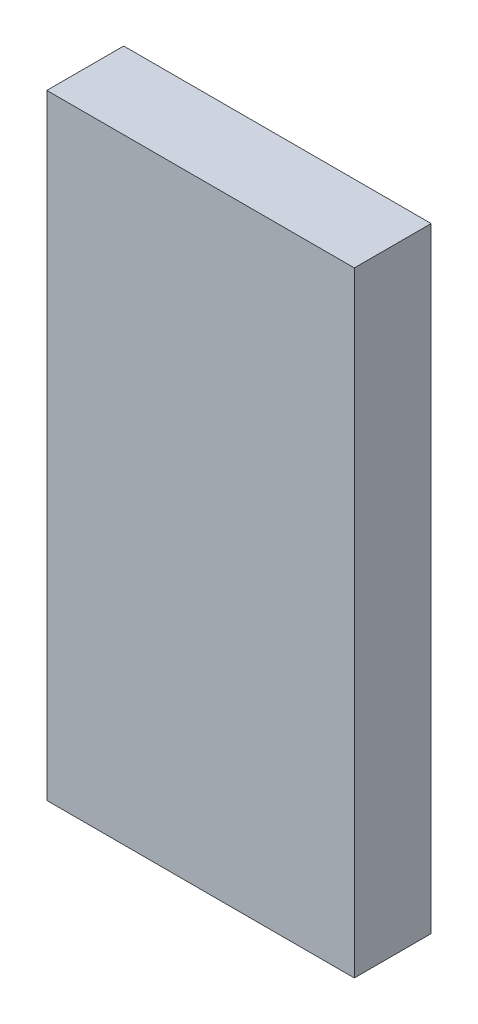
ISO-10303-21;
HEADER;
FILE_DESCRIPTION(('STEP AP214'),'2;1');
FILE_NAME('part.step','',(''),(''),'','','');
FILE_SCHEMA(('AUTOMOTIVE_DESIGN { 1 0 10303 214 1 1 1 1 }'));
ENDSEC;
DATA;
#1=APPLICATION_CONTEXT('core data for automotive mechanical design processes');
#2=APPLICATION_PROTOCOL_DEFINITION('international standard','automotive_design',2000,#1);
#3=PRODUCT_CONTEXT('',#1,'mechanical');
#4=PRODUCT('Part','Part','',(#3));
#5=PRODUCT_RELATED_PRODUCT_CATEGORY('part','',(#4));
#6=PRODUCT_DEFINITION_FORMATION('','',#4);
#7=PRODUCT_DEFINITION_CONTEXT('part definition',#1,'design');
#8=PRODUCT_DEFINITION('design','',#6,#7);
#9=PRODUCT_DEFINITION_SHAPE('','',#8);
#10=(LENGTH_UNIT() NAMED_UNIT(*) SI_UNIT(.MILLI.,.METRE.));
#11=(NAMED_UNIT(*) PLANE_ANGLE_UNIT() SI_UNIT($,.RADIAN.));
#12=(NAMED_UNIT(*) SI_UNIT($,.STERADIAN.) SOLID_ANGLE_UNIT());
#13=UNCERTAINTY_MEASURE_WITH_UNIT(LENGTH_MEASURE(1.E-05),#10,'distance_accuracy_value','');
#14=(GEOMETRIC_REPRESENTATION_CONTEXT(3) GLOBAL_UNCERTAINTY_ASSIGNED_CONTEXT((#13)) GLOBAL_UNIT_ASSIGNED_CONTEXT((#10,
#11,#12)) REPRESENTATION_CONTEXT('',''));
#15=CARTESIAN_POINT('',(0.,0.,0.));
#16=DIRECTION('',(0.,0.,1.));
#17=DIRECTION('',(1.,0.,0.));
#18=AXIS2_PLACEMENT_3D('',#15,#16,#17);
#19=CARTESIAN_POINT('',(5.,10.,2.5));
#20=DIRECTION('',(-1.,0.,0.));
#21=DIRECTION('',(0.,-1.,0.));
#22=AXIS2_PLACEMENT_3D('',#19,#20,#21);
#23=PLANE('',#22);
#24=DIRECTION('',(0.,1.,0.));
#25=VECTOR('',#24,1.);
#26=CARTESIAN_POINT('',(5.,10.,0.));
#27=LINE('',#26,#25);
#28=CARTESIAN_POINT('',(5.,-10.,0.));
#29=VERTEX_POINT('',#28);
#30=CARTESIAN_POINT('',(5.,10.,0.));
#31=VERTEX_POINT('',#30);
#32=EDGE_CURVE('E96',#29,#31,#27,.T.);
#33=ORIENTED_EDGE('',*,*,#32,.T.);
#34=DIRECTION('',(0.,0.,-1.));
#35=VECTOR('',#34,1.);
#36=CARTESIAN_POINT('',(5.,10.,2.5));
#37=LINE('',#36,#35);
#38=CARTESIAN_POINT('',(5.,10.,2.5));
#39=VERTEX_POINT('',#38);
#40=EDGE_CURVE('E11',#39,#31,#37,.T.);
#41=ORIENTED_EDGE('',*,*,#40,.F.);
#42=DIRECTION('',(0.,1.,0.));
#43=VECTOR('',#42,1.);
#44=CARTESIAN_POINT('',(5.,10.,2.5));
#45=LINE('',#44,#43);
#46=CARTESIAN_POINT('',(5.,-10.,2.5));
#47=VERTEX_POINT('',#46);
#48=EDGE_CURVE('E84',#47,#39,#45,.T.);
#49=ORIENTED_EDGE('',*,*,#48,.F.);
#50=DIRECTION('',(0.,0.,-1.));
#51=VECTOR('',#50,1.);
#52=CARTESIAN_POINT('',(5.,-10.,2.5));
#53=LINE('',#52,#51);
#54=EDGE_CURVE('E92',#47,#29,#53,.T.);
#55=ORIENTED_EDGE('',*,*,#54,.T.);
#56=EDGE_LOOP('',(#33,#41,#49,#55));
#57=FACE_BOUND('',#56,.T.);
#58=ADVANCED_FACE('F33',(#57),#23,.F.);
#59=CARTESIAN_POINT('',(-5.,10.,2.5));
#60=DIRECTION('',(0.,-1.,0.));
#61=DIRECTION('',(0.,0.,-1.));
#62=AXIS2_PLACEMENT_3D('',#59,#60,#61);
#63=PLANE('',#62);
#64=DIRECTION('',(-1.,0.,0.));
#65=VECTOR('',#64,1.);
#66=CARTESIAN_POINT('',(-5.,10.,0.));
#67=LINE('',#66,#65);
#68=CARTESIAN_POINT('',(-5.,10.,0.));
#69=VERTEX_POINT('',#68);
#70=EDGE_CURVE('E88',#31,#69,#67,.T.);
#71=ORIENTED_EDGE('',*,*,#70,.T.);
#72=DIRECTION('',(0.,0.,-1.));
#73=VECTOR('',#72,1.);
#74=CARTESIAN_POINT('',(-5.,10.,2.5));
#75=LINE('',#74,#73);
#76=CARTESIAN_POINT('',(-5.,10.,2.5));
#77=VERTEX_POINT('',#76);
#78=EDGE_CURVE('E41',#77,#69,#75,.T.);
#79=ORIENTED_EDGE('',*,*,#78,.F.);
#80=DIRECTION('',(-1.,0.,0.));
#81=VECTOR('',#80,1.);
#82=CARTESIAN_POINT('',(-5.,10.,2.5));
#83=LINE('',#82,#81);
#84=EDGE_CURVE('E79',#39,#77,#83,.T.);
#85=ORIENTED_EDGE('',*,*,#84,.F.);
#86=ORIENTED_EDGE('',*,*,#40,.T.);
#87=EDGE_LOOP('',(#71,#79,#85,#86));
#88=FACE_BOUND('',#87,.T.);
#89=ADVANCED_FACE('F87',(#88),#63,.F.);
#90=CARTESIAN_POINT('',(-5.,10.,2.5));
#91=DIRECTION('',(1.,0.,0.));
#92=DIRECTION('',(0.,1.,0.));
#93=AXIS2_PLACEMENT_3D('',#90,#91,#92);
#94=PLANE('',#93);
#95=DIRECTION('',(0.,-1.,0.));
#96=VECTOR('',#95,1.);
#97=CARTESIAN_POINT('',(-5.,10.,0.));
#98=LINE('',#97,#96);
#99=CARTESIAN_POINT('',(-5.,-10.,0.));
#100=VERTEX_POINT('',#99);
#101=EDGE_CURVE('E66',#69,#100,#98,.T.);
#102=ORIENTED_EDGE('',*,*,#101,.T.);
#103=DIRECTION('',(0.,0.,-1.));
#104=VECTOR('',#103,1.);
#105=CARTESIAN_POINT('',(-5.,-10.,2.5));
#106=LINE('',#105,#104);
#107=CARTESIAN_POINT('',(-5.,-10.,2.5));
#108=VERTEX_POINT('',#107);
#109=EDGE_CURVE('E89',#108,#100,#106,.T.);
#110=ORIENTED_EDGE('',*,*,#109,.F.);
#111=DIRECTION('',(0.,-1.,0.));
#112=VECTOR('',#111,1.);
#113=CARTESIAN_POINT('',(-5.,10.,2.5));
#114=LINE('',#113,#112);
#115=EDGE_CURVE('E82',#77,#108,#114,.T.);
#116=ORIENTED_EDGE('',*,*,#115,.F.);
#117=ORIENTED_EDGE('',*,*,#78,.T.);
#118=EDGE_LOOP('',(#102,#110,#116,#117));
#119=FACE_BOUND('',#118,.T.);
#120=ADVANCED_FACE('F90',(#119),#94,.F.);
#121=CARTESIAN_POINT('',(-5.,-10.,2.5));
#122=DIRECTION('',(0.,1.,0.));
#123=DIRECTION('',(0.,0.,1.));
#124=AXIS2_PLACEMENT_3D('',#121,#122,#123);
#125=PLANE('',#124);
#126=DIRECTION('',(1.,0.,0.));
#127=VECTOR('',#126,1.);
#128=CARTESIAN_POINT('',(-5.,-10.,0.));
#129=LINE('',#128,#127);
#130=EDGE_CURVE('E72',#100,#29,#129,.T.);
#131=ORIENTED_EDGE('',*,*,#130,.T.);
#132=ORIENTED_EDGE('',*,*,#54,.F.);
#133=DIRECTION('',(1.,0.,0.));
#134=VECTOR('',#133,1.);
#135=CARTESIAN_POINT('',(-5.,-10.,2.5));
#136=LINE('',#135,#134);
#137=EDGE_CURVE('E49',#108,#47,#136,.T.);
#138=ORIENTED_EDGE('',*,*,#137,.F.);
#139=ORIENTED_EDGE('',*,*,#109,.T.);
#140=EDGE_LOOP('',(#131,#132,#138,#139));
#141=FACE_BOUND('',#140,.T.);
#142=ADVANCED_FACE('F103',(#141),#125,.F.);
#143=CARTESIAN_POINT('',(0.,0.,2.5));
#144=DIRECTION('',(0.,0.,1.));
#145=DIRECTION('',(1.,0.,0.));
#146=AXIS2_PLACEMENT_3D('',#143,#144,#145);
#147=PLANE('',#146);
#148=ORIENTED_EDGE('',*,*,#48,.T.);
#149=ORIENTED_EDGE('',*,*,#84,.T.);
#150=ORIENTED_EDGE('',*,*,#115,.T.);
#151=ORIENTED_EDGE('',*,*,#137,.T.);
#152=EDGE_LOOP('',(#148,#149,#150,#151));
#153=FACE_BOUND('',#152,.T.);
#154=ADVANCED_FACE('F80',(#153),#147,.T.);
#155=CARTESIAN_POINT('',(0.,0.,0.));
#156=DIRECTION('',(0.,0.,1.));
#157=DIRECTION('',(1.,0.,0.));
#158=AXIS2_PLACEMENT_3D('',#155,#156,#157);
#159=PLANE('',#158);
#160=ORIENTED_EDGE('',*,*,#32,.F.);
#161=ORIENTED_EDGE('',*,*,#130,.F.);
#162=ORIENTED_EDGE('',*,*,#101,.F.);
#163=ORIENTED_EDGE('',*,*,#70,.F.);
#164=EDGE_LOOP('',(#160,#161,#162,#163));
#165=FACE_BOUND('',#164,.T.);
#166=ADVANCED_FACE('F106',(#165),#159,.F.);
#167=CLOSED_SHELL('',(#58,#89,#120,#142,#154,#166));
#168=MANIFOLD_SOLID_BREP('B2',#167);
#169=ADVANCED_BREP_SHAPE_REPRESENTATION('',(#18,#168),#14);
#170=SHAPE_DEFINITION_REPRESENTATION(#9,#169);
ENDSEC;
END-ISO-10303-21;
